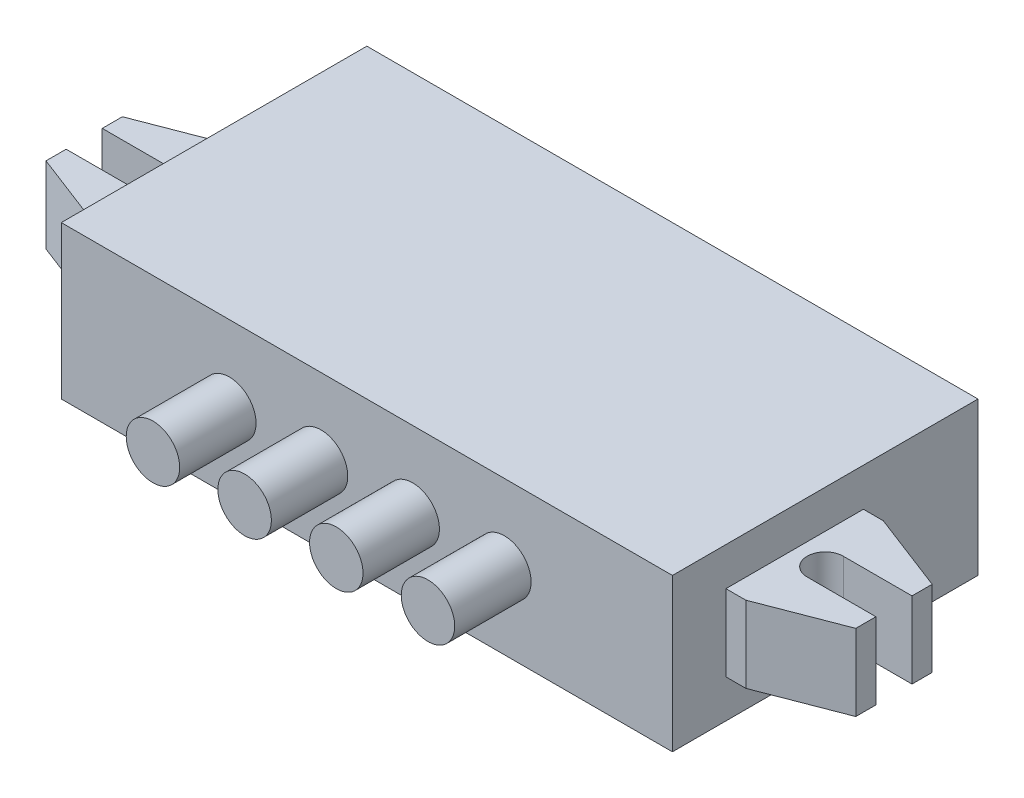
ISO-10303-21;
HEADER;
FILE_DESCRIPTION(('STEP AP214'),'2;1');
FILE_NAME('part.step','',(''),(''),'','','');
FILE_SCHEMA(('AUTOMOTIVE_DESIGN { 1 0 10303 214 1 1 1 1 }'));
ENDSEC;
DATA;
#1=APPLICATION_CONTEXT('core data for automotive mechanical design processes');
#2=APPLICATION_PROTOCOL_DEFINITION('international standard','automotive_design',2000,#1);
#3=PRODUCT_CONTEXT('',#1,'mechanical');
#4=PRODUCT('Part','Part','',(#3));
#5=PRODUCT_RELATED_PRODUCT_CATEGORY('part','',(#4));
#6=PRODUCT_DEFINITION_FORMATION('','',#4);
#7=PRODUCT_DEFINITION_CONTEXT('part definition',#1,'design');
#8=PRODUCT_DEFINITION('design','',#6,#7);
#9=PRODUCT_DEFINITION_SHAPE('','',#8);
#10=(LENGTH_UNIT() NAMED_UNIT(*) SI_UNIT(.MILLI.,.METRE.));
#11=(NAMED_UNIT(*) PLANE_ANGLE_UNIT() SI_UNIT($,.RADIAN.));
#12=(NAMED_UNIT(*) SI_UNIT($,.STERADIAN.) SOLID_ANGLE_UNIT());
#13=UNCERTAINTY_MEASURE_WITH_UNIT(LENGTH_MEASURE(1.E-05),#10,'distance_accuracy_value','');
#14=(GEOMETRIC_REPRESENTATION_CONTEXT(3) GLOBAL_UNCERTAINTY_ASSIGNED_CONTEXT((#13)) GLOBAL_UNIT_ASSIGNED_CONTEXT((#10,
#11,#12)) REPRESENTATION_CONTEXT('',''));
#15=CARTESIAN_POINT('',(0.,0.,0.));
#16=DIRECTION('',(0.,0.,1.));
#17=DIRECTION('',(1.,0.,0.));
#18=AXIS2_PLACEMENT_3D('',#15,#16,#17);
#19=CARTESIAN_POINT('',(25.4,6.35,-12.7));
#20=DIRECTION('',(-1.,0.,0.));
#21=DIRECTION('',(0.,0.,1.));
#22=AXIS2_PLACEMENT_3D('',#19,#20,#21);
#23=PLANE('',#22);
#24=DIRECTION('',(0.,-1.,0.));
#25=VECTOR('',#24,1.);
#26=CARTESIAN_POINT('',(25.4,3.175,-3.17500000000001));
#27=LINE('',#26,#25);
#28=CARTESIAN_POINT('',(25.4,3.175,-3.17500000000001));
#29=VERTEX_POINT('',#28);
#30=CARTESIAN_POINT('',(25.4,-3.175,-3.17500000000001));
#31=VERTEX_POINT('',#30);
#32=EDGE_CURVE('E478',#29,#31,#27,.T.);
#33=ORIENTED_EDGE('',*,*,#32,.T.);
#34=DIRECTION('',(0.,0.,1.));
#35=VECTOR('',#34,1.);
#36=CARTESIAN_POINT('',(25.4,-3.175,-3.17500000000001));
#37=LINE('',#36,#35);
#38=CARTESIAN_POINT('',(25.4,-3.175,8.25499999999998));
#39=VERTEX_POINT('',#38);
#40=EDGE_CURVE('E68',#31,#39,#37,.T.);
#41=ORIENTED_EDGE('',*,*,#40,.T.);
#42=DIRECTION('',(0.,-1.,0.));
#43=VECTOR('',#42,1.);
#44=CARTESIAN_POINT('',(25.4,3.175,8.25499999999998));
#45=LINE('',#44,#43);
#46=CARTESIAN_POINT('',(25.4,3.175,8.25499999999998));
#47=VERTEX_POINT('',#46);
#48=EDGE_CURVE('E483',#47,#39,#45,.T.);
#49=ORIENTED_EDGE('',*,*,#48,.F.);
#50=DIRECTION('',(0.,0.,1.));
#51=VECTOR('',#50,1.);
#52=CARTESIAN_POINT('',(25.4,3.175,-3.17500000000001));
#53=LINE('',#52,#51);
#54=EDGE_CURVE('E266',#29,#47,#53,.T.);
#55=ORIENTED_EDGE('',*,*,#54,.F.);
#56=EDGE_LOOP('',(#33,#41,#49,#55));
#57=FACE_BOUND('',#56,.T.);
#58=DIRECTION('',(0.,0.,-1.));
#59=VECTOR('',#58,1.);
#60=CARTESIAN_POINT('',(25.4,-6.35,-12.7));
#61=LINE('',#60,#59);
#62=CARTESIAN_POINT('',(25.4,-6.35,12.7));
#63=VERTEX_POINT('',#62);
#64=CARTESIAN_POINT('',(25.4,-6.35,-12.7));
#65=VERTEX_POINT('',#64);
#66=EDGE_CURVE('E380',#63,#65,#61,.T.);
#67=ORIENTED_EDGE('',*,*,#66,.T.);
#68=DIRECTION('',(0.,-1.,0.));
#69=VECTOR('',#68,1.);
#70=CARTESIAN_POINT('',(25.4,6.35,-12.7));
#71=LINE('',#70,#69);
#72=CARTESIAN_POINT('',(25.4,6.35,-12.7));
#73=VERTEX_POINT('',#72);
#74=EDGE_CURVE('E418',#73,#65,#71,.T.);
#75=ORIENTED_EDGE('',*,*,#74,.F.);
#76=DIRECTION('',(0.,0.,-1.));
#77=VECTOR('',#76,1.);
#78=CARTESIAN_POINT('',(25.4,6.35,-12.7));
#79=LINE('',#78,#77);
#80=CARTESIAN_POINT('',(25.4,6.35,12.7));
#81=VERTEX_POINT('',#80);
#82=EDGE_CURVE('E381',#81,#73,#79,.T.);
#83=ORIENTED_EDGE('',*,*,#82,.F.);
#84=DIRECTION('',(0.,-1.,0.));
#85=VECTOR('',#84,1.);
#86=CARTESIAN_POINT('',(25.4,6.35,12.7));
#87=LINE('',#86,#85);
#88=EDGE_CURVE('E395',#81,#63,#87,.T.);
#89=ORIENTED_EDGE('',*,*,#88,.T.);
#90=EDGE_LOOP('',(#67,#75,#83,#89));
#91=FACE_BOUND('',#90,.T.);
#92=ADVANCED_FACE('F53',(#57,#91),#23,.F.);
#93=CARTESIAN_POINT('',(-25.4,6.35,-12.7));
#94=DIRECTION('',(0.,0.,1.));
#95=DIRECTION('',(1.,0.,0.));
#96=AXIS2_PLACEMENT_3D('',#93,#94,#95);
#97=PLANE('',#96);
#98=DIRECTION('',(-1.,0.,0.));
#99=VECTOR('',#98,1.);
#100=CARTESIAN_POINT('',(-25.4,-6.35,-12.7));
#101=LINE('',#100,#99);
#102=CARTESIAN_POINT('',(-25.4,-6.35,-12.7));
#103=VERTEX_POINT('',#102);
#104=EDGE_CURVE('E399',#65,#103,#101,.T.);
#105=ORIENTED_EDGE('',*,*,#104,.T.);
#106=DIRECTION('',(0.,-1.,0.));
#107=VECTOR('',#106,1.);
#108=CARTESIAN_POINT('',(-25.4,6.35,-12.7));
#109=LINE('',#108,#107);
#110=CARTESIAN_POINT('',(-25.4,6.35,-12.7));
#111=VERTEX_POINT('',#110);
#112=EDGE_CURVE('E414',#111,#103,#109,.T.);
#113=ORIENTED_EDGE('',*,*,#112,.F.);
#114=DIRECTION('',(-1.,0.,0.));
#115=VECTOR('',#114,1.);
#116=CARTESIAN_POINT('',(-25.4,6.35,-12.7));
#117=LINE('',#116,#115);
#118=EDGE_CURVE('E385',#73,#111,#117,.T.);
#119=ORIENTED_EDGE('',*,*,#118,.F.);
#120=ORIENTED_EDGE('',*,*,#74,.T.);
#121=EDGE_LOOP('',(#105,#113,#119,#120));
#122=FACE_BOUND('',#121,.T.);
#123=ADVANCED_FACE('F459',(#122),#97,.F.);
#124=CARTESIAN_POINT('',(-25.4,6.35,-12.7));
#125=DIRECTION('',(1.,0.,0.));
#126=DIRECTION('',(0.,0.,-1.));
#127=AXIS2_PLACEMENT_3D('',#124,#125,#126);
#128=PLANE('',#127);
#129=DIRECTION('',(0.,-1.,0.));
#130=VECTOR('',#129,1.);
#131=CARTESIAN_POINT('',(-25.4,3.175,8.255));
#132=LINE('',#131,#130);
#133=CARTESIAN_POINT('',(-25.4,3.175,8.255));
#134=VERTEX_POINT('',#133);
#135=CARTESIAN_POINT('',(-25.4,-3.175,8.255));
#136=VERTEX_POINT('',#135);
#137=EDGE_CURVE('E314',#134,#136,#132,.T.);
#138=ORIENTED_EDGE('',*,*,#137,.T.);
#139=DIRECTION('',(0.,0.,-1.));
#140=VECTOR('',#139,1.);
#141=CARTESIAN_POINT('',(-25.4,-3.175,-3.175));
#142=LINE('',#141,#140);
#143=CARTESIAN_POINT('',(-25.4,-3.175,-3.175));
#144=VERTEX_POINT('',#143);
#145=EDGE_CURVE('E76',#136,#144,#142,.T.);
#146=ORIENTED_EDGE('',*,*,#145,.T.);
#147=DIRECTION('',(0.,-1.,0.));
#148=VECTOR('',#147,1.);
#149=CARTESIAN_POINT('',(-25.4,3.175,-3.175));
#150=LINE('',#149,#148);
#151=CARTESIAN_POINT('',(-25.4,3.175,-3.175));
#152=VERTEX_POINT('',#151);
#153=EDGE_CURVE('E376',#152,#144,#150,.T.);
#154=ORIENTED_EDGE('',*,*,#153,.F.);
#155=DIRECTION('',(0.,0.,-1.));
#156=VECTOR('',#155,1.);
#157=CARTESIAN_POINT('',(-25.4,3.175,-3.175));
#158=LINE('',#157,#156);
#159=EDGE_CURVE('E283',#134,#152,#158,.T.);
#160=ORIENTED_EDGE('',*,*,#159,.F.);
#161=EDGE_LOOP('',(#138,#146,#154,#160));
#162=FACE_BOUND('',#161,.T.);
#163=DIRECTION('',(0.,0.,1.));
#164=VECTOR('',#163,1.);
#165=CARTESIAN_POINT('',(-25.4,-6.35,-12.7));
#166=LINE('',#165,#164);
#167=CARTESIAN_POINT('',(-25.4,-6.35,12.7));
#168=VERTEX_POINT('',#167);
#169=EDGE_CURVE('E402',#103,#168,#166,.T.);
#170=ORIENTED_EDGE('',*,*,#169,.T.);
#171=DIRECTION('',(0.,-1.,0.));
#172=VECTOR('',#171,1.);
#173=CARTESIAN_POINT('',(-25.4,6.35,12.7));
#174=LINE('',#173,#172);
#175=CARTESIAN_POINT('',(-25.4,6.35,12.7));
#176=VERTEX_POINT('',#175);
#177=EDGE_CURVE('E410',#176,#168,#174,.T.);
#178=ORIENTED_EDGE('',*,*,#177,.F.);
#179=DIRECTION('',(0.,0.,1.));
#180=VECTOR('',#179,1.);
#181=CARTESIAN_POINT('',(-25.4,6.35,-12.7));
#182=LINE('',#181,#180);
#183=EDGE_CURVE('E389',#111,#176,#182,.T.);
#184=ORIENTED_EDGE('',*,*,#183,.F.);
#185=ORIENTED_EDGE('',*,*,#112,.T.);
#186=EDGE_LOOP('',(#170,#178,#184,#185));
#187=FACE_BOUND('',#186,.T.);
#188=ADVANCED_FACE('F439',(#162,#187),#128,.F.);
#189=CARTESIAN_POINT('',(-25.4,6.35,12.7));
#190=DIRECTION('',(0.,0.,-1.));
#191=DIRECTION('',(-1.,0.,0.));
#192=AXIS2_PLACEMENT_3D('',#189,#190,#191);
#193=PLANE('',#192);
#194=CARTESIAN_POINT('',(3.81,0.,12.7));
#195=DIRECTION('',(0.,0.,-1.));
#196=DIRECTION('',(-1.,0.,0.));
#197=AXIS2_PLACEMENT_3D('',#194,#195,#196);
#198=CIRCLE('',#197,2.2225);
#199=CARTESIAN_POINT('',(1.5875,0.,12.7));
#200=VERTEX_POINT('',#199);
#201=EDGE_CURVE('E11',#200,#200,#198,.F.);
#202=ORIENTED_EDGE('',*,*,#201,.F.);
#203=EDGE_LOOP('',(#202));
#204=FACE_BOUND('',#203,.T.);
#205=CARTESIAN_POINT('',(11.43,0.,12.7));
#206=DIRECTION('',(0.,0.,-1.));
#207=DIRECTION('',(-1.,0.,0.));
#208=AXIS2_PLACEMENT_3D('',#205,#206,#207);
#209=CIRCLE('',#208,2.2225);
#210=CARTESIAN_POINT('',(9.2075,0.,12.7));
#211=VERTEX_POINT('',#210);
#212=EDGE_CURVE('E61',#211,#211,#209,.F.);
#213=ORIENTED_EDGE('',*,*,#212,.F.);
#214=EDGE_LOOP('',(#213));
#215=FACE_BOUND('',#214,.T.);
#216=CARTESIAN_POINT('',(-11.43,0.,12.7));
#217=DIRECTION('',(0.,0.,-1.));
#218=DIRECTION('',(-1.,0.,0.));
#219=AXIS2_PLACEMENT_3D('',#216,#217,#218);
#220=CIRCLE('',#219,2.2225);
#221=CARTESIAN_POINT('',(-13.6525,0.,12.7));
#222=VERTEX_POINT('',#221);
#223=EDGE_CURVE('E426',#222,#222,#220,.F.);
#224=ORIENTED_EDGE('',*,*,#223,.F.);
#225=EDGE_LOOP('',(#224));
#226=FACE_BOUND('',#225,.T.);
#227=CARTESIAN_POINT('',(-3.81,0.,12.7));
#228=DIRECTION('',(0.,0.,-1.));
#229=DIRECTION('',(-1.,0.,0.));
#230=AXIS2_PLACEMENT_3D('',#227,#228,#229);
#231=CIRCLE('',#230,2.2225);
#232=CARTESIAN_POINT('',(-6.0325,0.,12.7));
#233=VERTEX_POINT('',#232);
#234=EDGE_CURVE('E422',#233,#233,#231,.F.);
#235=ORIENTED_EDGE('',*,*,#234,.F.);
#236=EDGE_LOOP('',(#235));
#237=FACE_BOUND('',#236,.T.);
#238=DIRECTION('',(1.,0.,0.));
#239=VECTOR('',#238,1.);
#240=CARTESIAN_POINT('',(-25.4,-6.35,12.7));
#241=LINE('',#240,#239);
#242=EDGE_CURVE('E386',#168,#63,#241,.T.);
#243=ORIENTED_EDGE('',*,*,#242,.T.);
#244=ORIENTED_EDGE('',*,*,#88,.F.);
#245=DIRECTION('',(1.,0.,0.));
#246=VECTOR('',#245,1.);
#247=CARTESIAN_POINT('',(-25.4,6.35,12.7));
#248=LINE('',#247,#246);
#249=EDGE_CURVE('E392',#176,#81,#248,.T.);
#250=ORIENTED_EDGE('',*,*,#249,.F.);
#251=ORIENTED_EDGE('',*,*,#177,.T.);
#252=EDGE_LOOP('',(#243,#244,#250,#251));
#253=FACE_BOUND('',#252,.T.);
#254=ADVANCED_FACE('F435',(#204,#215,#226,#237,#253),#193,.F.);
#255=CARTESIAN_POINT('',(0.,6.35,0.));
#256=DIRECTION('',(0.,1.,0.));
#257=DIRECTION('',(0.,0.,1.));
#258=AXIS2_PLACEMENT_3D('',#255,#256,#257);
#259=PLANE('',#258);
#260=ORIENTED_EDGE('',*,*,#82,.T.);
#261=ORIENTED_EDGE('',*,*,#118,.T.);
#262=ORIENTED_EDGE('',*,*,#183,.T.);
#263=ORIENTED_EDGE('',*,*,#249,.T.);
#264=EDGE_LOOP('',(#260,#261,#262,#263));
#265=FACE_BOUND('',#264,.T.);
#266=ADVANCED_FACE('F438',(#265),#259,.T.);
#267=CARTESIAN_POINT('',(0.,-6.35,0.));
#268=DIRECTION('',(0.,1.,0.));
#269=DIRECTION('',(0.,0.,1.));
#270=AXIS2_PLACEMENT_3D('',#267,#268,#269);
#271=PLANE('',#270);
#272=ORIENTED_EDGE('',*,*,#66,.F.);
#273=ORIENTED_EDGE('',*,*,#242,.F.);
#274=ORIENTED_EDGE('',*,*,#169,.F.);
#275=ORIENTED_EDGE('',*,*,#104,.F.);
#276=EDGE_LOOP('',(#272,#273,#274,#275));
#277=FACE_BOUND('',#276,.T.);
#278=ADVANCED_FACE('F456',(#277),#271,.F.);
#279=CARTESIAN_POINT('',(-25.4,3.175,-3.175));
#280=DIRECTION('',(0.,0.,1.));
#281=DIRECTION('',(1.,0.,0.));
#282=AXIS2_PLACEMENT_3D('',#279,#280,#281);
#283=PLANE('',#282);
#284=DIRECTION('',(-1.,0.,0.));
#285=VECTOR('',#284,1.);
#286=CARTESIAN_POINT('',(-25.4,-3.175,-3.175));
#287=LINE('',#286,#285);
#288=CARTESIAN_POINT('',(-27.051,-3.175,-3.175));
#289=VERTEX_POINT('',#288);
#290=EDGE_CURVE('E249',#144,#289,#287,.T.);
#291=ORIENTED_EDGE('',*,*,#290,.T.);
#292=DIRECTION('',(0.,-1.,0.));
#293=VECTOR('',#292,1.);
#294=CARTESIAN_POINT('',(-27.051,3.175,-3.175));
#295=LINE('',#294,#293);
#296=CARTESIAN_POINT('',(-27.051,3.175,-3.175));
#297=VERTEX_POINT('',#296);
#298=EDGE_CURVE('E372',#297,#289,#295,.T.);
#299=ORIENTED_EDGE('',*,*,#298,.F.);
#300=DIRECTION('',(-1.,0.,0.));
#301=VECTOR('',#300,1.);
#302=CARTESIAN_POINT('',(-25.4,3.175,-3.175));
#303=LINE('',#302,#301);
#304=EDGE_CURVE('E287',#152,#297,#303,.T.);
#305=ORIENTED_EDGE('',*,*,#304,.F.);
#306=ORIENTED_EDGE('',*,*,#153,.T.);
#307=EDGE_LOOP('',(#291,#299,#305,#306));
#308=FACE_BOUND('',#307,.T.);
#309=ADVANCED_FACE('F664',(#308),#283,.F.);
#310=CARTESIAN_POINT('',(-27.051,3.175,-3.175));
#311=DIRECTION('',(0.358979079308869,0.,0.933345606203059));
#312=DIRECTION('',(0.93334560620306,0.,-0.358979079308869));
#313=AXIS2_PLACEMENT_3D('',#310,#311,#312);
#314=PLANE('',#313);
#315=DIRECTION('',(-0.933345606203059,0.,0.358979079308869));
#316=VECTOR('',#315,1.);
#317=CARTESIAN_POINT('',(-27.051,-3.175,-3.175));
#318=LINE('',#317,#316);
#319=CARTESIAN_POINT('',(-33.655,-3.175,-0.635));
#320=VERTEX_POINT('',#319);
#321=EDGE_CURVE('E318',#289,#320,#318,.T.);
#322=ORIENTED_EDGE('',*,*,#321,.T.);
#323=DIRECTION('',(0.,-1.,0.));
#324=VECTOR('',#323,1.);
#325=CARTESIAN_POINT('',(-33.655,3.175,-0.635));
#326=LINE('',#325,#324);
#327=CARTESIAN_POINT('',(-33.655,3.175,-0.635));
#328=VERTEX_POINT('',#327);
#329=EDGE_CURVE('E368',#328,#320,#326,.T.);
#330=ORIENTED_EDGE('',*,*,#329,.F.);
#331=DIRECTION('',(-0.933345606203059,0.,0.358979079308869));
#332=VECTOR('',#331,1.);
#333=CARTESIAN_POINT('',(-27.051,3.175,-3.175));
#334=LINE('',#333,#332);
#335=EDGE_CURVE('E291',#297,#328,#334,.T.);
#336=ORIENTED_EDGE('',*,*,#335,.F.);
#337=ORIENTED_EDGE('',*,*,#298,.T.);
#338=EDGE_LOOP('',(#322,#330,#336,#337));
#339=FACE_BOUND('',#338,.T.);
#340=ADVANCED_FACE('F660',(#339),#314,.F.);
#341=CARTESIAN_POINT('',(-33.655,3.175,-0.635));
#342=DIRECTION('',(1.,0.,0.));
#343=DIRECTION('',(0.,0.,-1.));
#344=AXIS2_PLACEMENT_3D('',#341,#342,#343);
#345=PLANE('',#344);
#346=DIRECTION('',(0.,0.,1.));
#347=VECTOR('',#346,1.);
#348=CARTESIAN_POINT('',(-33.655,-3.175,-0.635));
#349=LINE('',#348,#347);
#350=CARTESIAN_POINT('',(-33.655,-3.175,1.04));
#351=VERTEX_POINT('',#350);
#352=EDGE_CURVE('E321',#320,#351,#349,.T.);
#353=ORIENTED_EDGE('',*,*,#352,.T.);
#354=DIRECTION('',(0.,-1.,0.));
#355=VECTOR('',#354,1.);
#356=CARTESIAN_POINT('',(-33.655,3.175,1.04));
#357=LINE('',#356,#355);
#358=CARTESIAN_POINT('',(-33.655,3.175,1.04));
#359=VERTEX_POINT('',#358);
#360=EDGE_CURVE('E364',#359,#351,#357,.T.);
#361=ORIENTED_EDGE('',*,*,#360,.F.);
#362=DIRECTION('',(0.,0.,1.));
#363=VECTOR('',#362,1.);
#364=CARTESIAN_POINT('',(-33.655,3.175,-0.635));
#365=LINE('',#364,#363);
#366=EDGE_CURVE('E294',#328,#359,#365,.T.);
#367=ORIENTED_EDGE('',*,*,#366,.F.);
#368=ORIENTED_EDGE('',*,*,#329,.T.);
#369=EDGE_LOOP('',(#353,#361,#367,#368));
#370=FACE_BOUND('',#369,.T.);
#371=ADVANCED_FACE('F656',(#370),#345,.F.);
#372=CARTESIAN_POINT('',(-33.655,3.175,1.04));
#373=DIRECTION('',(0.,0.,-1.));
#374=DIRECTION('',(-1.,0.,0.));
#375=AXIS2_PLACEMENT_3D('',#372,#373,#374);
#376=PLANE('',#375);
#377=DIRECTION('',(1.,0.,0.));
#378=VECTOR('',#377,1.);
#379=CARTESIAN_POINT('',(-33.655,-3.175,1.04));
#380=LINE('',#379,#378);
#381=CARTESIAN_POINT('',(-27.94,-3.175,1.04));
#382=VERTEX_POINT('',#381);
#383=EDGE_CURVE('E324',#351,#382,#380,.T.);
#384=ORIENTED_EDGE('',*,*,#383,.T.);
#385=DIRECTION('',(0.,-1.,0.));
#386=VECTOR('',#385,1.);
#387=CARTESIAN_POINT('',(-27.94,3.175,1.04));
#388=LINE('',#387,#386);
#389=CARTESIAN_POINT('',(-27.94,3.175,1.04));
#390=VERTEX_POINT('',#389);
#391=EDGE_CURVE('E360',#390,#382,#388,.T.);
#392=ORIENTED_EDGE('',*,*,#391,.F.);
#393=DIRECTION('',(1.,0.,0.));
#394=VECTOR('',#393,1.);
#395=CARTESIAN_POINT('',(-33.655,3.175,1.04));
#396=LINE('',#395,#394);
#397=EDGE_CURVE('E297',#359,#390,#396,.T.);
#398=ORIENTED_EDGE('',*,*,#397,.F.);
#399=ORIENTED_EDGE('',*,*,#360,.T.);
#400=EDGE_LOOP('',(#384,#392,#398,#399));
#401=FACE_BOUND('',#400,.T.);
#402=ADVANCED_FACE('F652',(#401),#376,.F.);
#403=CARTESIAN_POINT('',(-27.94,3.175,2.54));
#404=DIRECTION('',(0.,-1.,0.));
#405=DIRECTION('',(0.,0.,-1.));
#406=AXIS2_PLACEMENT_3D('',#403,#404,#405);
#407=CYLINDRICAL_SURFACE('',#406,1.5);
#408=CARTESIAN_POINT('',(-27.94,-3.175,2.54));
#409=DIRECTION('',(0.,-1.,0.));
#410=DIRECTION('',(0.,0.,1.));
#411=AXIS2_PLACEMENT_3D('',#408,#409,#410);
#412=CIRCLE('',#411,1.5);
#413=CARTESIAN_POINT('',(-27.94,-3.175,4.04));
#414=VERTEX_POINT('',#413);
#415=EDGE_CURVE('E327',#382,#414,#412,.T.);
#416=ORIENTED_EDGE('',*,*,#415,.T.);
#417=DIRECTION('',(0.,-1.,0.));
#418=VECTOR('',#417,1.);
#419=CARTESIAN_POINT('',(-27.94,3.175,4.04));
#420=LINE('',#419,#418);
#421=CARTESIAN_POINT('',(-27.94,3.175,4.04));
#422=VERTEX_POINT('',#421);
#423=EDGE_CURVE('E356',#422,#414,#420,.T.);
#424=ORIENTED_EDGE('',*,*,#423,.F.);
#425=CARTESIAN_POINT('',(-27.94,3.175,2.54));
#426=DIRECTION('',(0.,-1.,0.));
#427=DIRECTION('',(0.,0.,1.));
#428=AXIS2_PLACEMENT_3D('',#425,#426,#427);
#429=CIRCLE('',#428,1.5);
#430=EDGE_CURVE('E300',#390,#422,#429,.T.);
#431=ORIENTED_EDGE('',*,*,#430,.F.);
#432=ORIENTED_EDGE('',*,*,#391,.T.);
#433=EDGE_LOOP('',(#416,#424,#431,#432));
#434=FACE_BOUND('',#433,.T.);
#435=ADVANCED_FACE('F648',(#434),#407,.F.);
#436=CARTESIAN_POINT('',(-33.655,3.175,4.04));
#437=DIRECTION('',(0.,0.,1.));
#438=DIRECTION('',(1.,0.,0.));
#439=AXIS2_PLACEMENT_3D('',#436,#437,#438);
#440=PLANE('',#439);
#441=DIRECTION('',(-1.,0.,0.));
#442=VECTOR('',#441,1.);
#443=CARTESIAN_POINT('',(-33.655,-3.175,4.04));
#444=LINE('',#443,#442);
#445=CARTESIAN_POINT('',(-33.655,-3.175,4.04));
#446=VERTEX_POINT('',#445);
#447=EDGE_CURVE('E330',#414,#446,#444,.T.);
#448=ORIENTED_EDGE('',*,*,#447,.T.);
#449=DIRECTION('',(0.,-1.,0.));
#450=VECTOR('',#449,1.);
#451=CARTESIAN_POINT('',(-33.655,3.175,4.04));
#452=LINE('',#451,#450);
#453=CARTESIAN_POINT('',(-33.655,3.175,4.04));
#454=VERTEX_POINT('',#453);
#455=EDGE_CURVE('E352',#454,#446,#452,.T.);
#456=ORIENTED_EDGE('',*,*,#455,.F.);
#457=DIRECTION('',(-1.,0.,0.));
#458=VECTOR('',#457,1.);
#459=CARTESIAN_POINT('',(-33.655,3.175,4.04));
#460=LINE('',#459,#458);
#461=EDGE_CURVE('E303',#422,#454,#460,.T.);
#462=ORIENTED_EDGE('',*,*,#461,.F.);
#463=ORIENTED_EDGE('',*,*,#423,.T.);
#464=EDGE_LOOP('',(#448,#456,#462,#463));
#465=FACE_BOUND('',#464,.T.);
#466=ADVANCED_FACE('F644',(#465),#440,.F.);
#467=CARTESIAN_POINT('',(-33.655,3.175,5.715));
#468=DIRECTION('',(1.,0.,0.));
#469=DIRECTION('',(0.,0.,-1.));
#470=AXIS2_PLACEMENT_3D('',#467,#468,#469);
#471=PLANE('',#470);
#472=DIRECTION('',(0.,0.,1.));
#473=VECTOR('',#472,1.);
#474=CARTESIAN_POINT('',(-33.655,-3.175,5.715));
#475=LINE('',#474,#473);
#476=CARTESIAN_POINT('',(-33.655,-3.175,5.715));
#477=VERTEX_POINT('',#476);
#478=EDGE_CURVE('E333',#446,#477,#475,.T.);
#479=ORIENTED_EDGE('',*,*,#478,.T.);
#480=DIRECTION('',(0.,-1.,0.));
#481=VECTOR('',#480,1.);
#482=CARTESIAN_POINT('',(-33.655,3.175,5.715));
#483=LINE('',#482,#481);
#484=CARTESIAN_POINT('',(-33.655,3.175,5.715));
#485=VERTEX_POINT('',#484);
#486=EDGE_CURVE('E348',#485,#477,#483,.T.);
#487=ORIENTED_EDGE('',*,*,#486,.F.);
#488=DIRECTION('',(0.,0.,1.));
#489=VECTOR('',#488,1.);
#490=CARTESIAN_POINT('',(-33.655,3.175,5.715));
#491=LINE('',#490,#489);
#492=EDGE_CURVE('E306',#454,#485,#491,.T.);
#493=ORIENTED_EDGE('',*,*,#492,.F.);
#494=ORIENTED_EDGE('',*,*,#455,.T.);
#495=EDGE_LOOP('',(#479,#487,#493,#494));
#496=FACE_BOUND('',#495,.T.);
#497=ADVANCED_FACE('F640',(#496),#471,.F.);
#498=CARTESIAN_POINT('',(-27.051,3.175,8.255));
#499=DIRECTION('',(0.358979079308869,0.,-0.933345606203059));
#500=DIRECTION('',(-0.93334560620306,0.,-0.358979079308869));
#501=AXIS2_PLACEMENT_3D('',#498,#499,#500);
#502=PLANE('',#501);
#503=DIRECTION('',(0.933345606203059,0.,0.358979079308869));
#504=VECTOR('',#503,1.);
#505=CARTESIAN_POINT('',(-27.051,-3.175,8.255));
#506=LINE('',#505,#504);
#507=CARTESIAN_POINT('',(-27.051,-3.175,8.255));
#508=VERTEX_POINT('',#507);
#509=EDGE_CURVE('E336',#477,#508,#506,.T.);
#510=ORIENTED_EDGE('',*,*,#509,.T.);
#511=DIRECTION('',(0.,-1.,0.));
#512=VECTOR('',#511,1.);
#513=CARTESIAN_POINT('',(-27.051,3.175,8.255));
#514=LINE('',#513,#512);
#515=CARTESIAN_POINT('',(-27.051,3.175,8.255));
#516=VERTEX_POINT('',#515);
#517=EDGE_CURVE('E344',#516,#508,#514,.T.);
#518=ORIENTED_EDGE('',*,*,#517,.F.);
#519=DIRECTION('',(0.933345606203059,0.,0.358979079308869));
#520=VECTOR('',#519,1.);
#521=CARTESIAN_POINT('',(-27.051,3.175,8.255));
#522=LINE('',#521,#520);
#523=EDGE_CURVE('E309',#485,#516,#522,.T.);
#524=ORIENTED_EDGE('',*,*,#523,.F.);
#525=ORIENTED_EDGE('',*,*,#486,.T.);
#526=EDGE_LOOP('',(#510,#518,#524,#525));
#527=FACE_BOUND('',#526,.T.);
#528=ADVANCED_FACE('F636',(#527),#502,.F.);
#529=CARTESIAN_POINT('',(-25.4,3.175,8.255));
#530=DIRECTION('',(0.,0.,-1.));
#531=DIRECTION('',(-1.,0.,0.));
#532=AXIS2_PLACEMENT_3D('',#529,#530,#531);
#533=PLANE('',#532);
#534=DIRECTION('',(1.,0.,0.));
#535=VECTOR('',#534,1.);
#536=CARTESIAN_POINT('',(-25.4,-3.175,8.255));
#537=LINE('',#536,#535);
#538=EDGE_CURVE('E288',#508,#136,#537,.T.);
#539=ORIENTED_EDGE('',*,*,#538,.T.);
#540=ORIENTED_EDGE('',*,*,#137,.F.);
#541=DIRECTION('',(1.,0.,0.));
#542=VECTOR('',#541,1.);
#543=CARTESIAN_POINT('',(-25.4,3.175,8.255));
#544=LINE('',#543,#542);
#545=EDGE_CURVE('E312',#516,#134,#544,.T.);
#546=ORIENTED_EDGE('',*,*,#545,.F.);
#547=ORIENTED_EDGE('',*,*,#517,.T.);
#548=EDGE_LOOP('',(#539,#540,#546,#547));
#549=FACE_BOUND('',#548,.T.);
#550=ADVANCED_FACE('F630',(#549),#533,.F.);
#551=CARTESIAN_POINT('',(-27.94,3.175,2.54));
#552=DIRECTION('',(0.,1.,0.));
#553=DIRECTION('',(0.,0.,1.));
#554=AXIS2_PLACEMENT_3D('',#551,#552,#553);
#555=PLANE('',#554);
#556=ORIENTED_EDGE('',*,*,#159,.T.);
#557=ORIENTED_EDGE('',*,*,#304,.T.);
#558=ORIENTED_EDGE('',*,*,#335,.T.);
#559=ORIENTED_EDGE('',*,*,#366,.T.);
#560=ORIENTED_EDGE('',*,*,#397,.T.);
#561=ORIENTED_EDGE('',*,*,#430,.T.);
#562=ORIENTED_EDGE('',*,*,#461,.T.);
#563=ORIENTED_EDGE('',*,*,#492,.T.);
#564=ORIENTED_EDGE('',*,*,#523,.T.);
#565=ORIENTED_EDGE('',*,*,#545,.T.);
#566=EDGE_LOOP('',(#556,#557,#558,#559,#560,#561,#562,#563,#564,#565));
#567=FACE_BOUND('',#566,.T.);
#568=ADVANCED_FACE('F627',(#567),#555,.T.);
#569=CARTESIAN_POINT('',(-27.94,-3.175,2.54));
#570=DIRECTION('',(0.,1.,0.));
#571=DIRECTION('',(0.,0.,1.));
#572=AXIS2_PLACEMENT_3D('',#569,#570,#571);
#573=PLANE('',#572);
#574=ORIENTED_EDGE('',*,*,#145,.F.);
#575=ORIENTED_EDGE('',*,*,#538,.F.);
#576=ORIENTED_EDGE('',*,*,#509,.F.);
#577=ORIENTED_EDGE('',*,*,#478,.F.);
#578=ORIENTED_EDGE('',*,*,#447,.F.);
#579=ORIENTED_EDGE('',*,*,#415,.F.);
#580=ORIENTED_EDGE('',*,*,#383,.F.);
#581=ORIENTED_EDGE('',*,*,#352,.F.);
#582=ORIENTED_EDGE('',*,*,#321,.F.);
#583=ORIENTED_EDGE('',*,*,#290,.F.);
#584=EDGE_LOOP('',(#574,#575,#576,#577,#578,#579,#580,#581,#582,#583));
#585=FACE_BOUND('',#584,.T.);
#586=ADVANCED_FACE('F600',(#585),#573,.F.);
#587=CARTESIAN_POINT('',(27.94,3.175,2.53999999999999));
#588=DIRECTION('',(0.,-1.,0.));
#589=DIRECTION('',(0.,0.,-1.));
#590=AXIS2_PLACEMENT_3D('',#587,#588,#589);
#591=CYLINDRICAL_SURFACE('',#590,1.5);
#592=CARTESIAN_POINT('',(27.94,-3.175,2.53999999999999));
#593=DIRECTION('',(0.,-1.,0.));
#594=DIRECTION('',(0.,0.,-1.));
#595=AXIS2_PLACEMENT_3D('',#592,#593,#594);
#596=CIRCLE('',#595,1.5);
#597=CARTESIAN_POINT('',(27.94,-3.175,4.03999999999999));
#598=VERTEX_POINT('',#597);
#599=CARTESIAN_POINT('',(27.94,-3.175,1.03999999999999));
#600=VERTEX_POINT('',#599);
#601=EDGE_CURVE('E236',#598,#600,#596,.T.);
#602=ORIENTED_EDGE('',*,*,#601,.T.);
#603=DIRECTION('',(0.,-1.,0.));
#604=VECTOR('',#603,1.);
#605=CARTESIAN_POINT('',(27.94,3.175,1.03999999999999));
#606=LINE('',#605,#604);
#607=CARTESIAN_POINT('',(27.94,3.175,1.03999999999999));
#608=VERTEX_POINT('',#607);
#609=EDGE_CURVE('E541',#608,#600,#606,.T.);
#610=ORIENTED_EDGE('',*,*,#609,.F.);
#611=CARTESIAN_POINT('',(27.94,3.175,2.53999999999999));
#612=DIRECTION('',(0.,-1.,0.));
#613=DIRECTION('',(0.,0.,-1.));
#614=AXIS2_PLACEMENT_3D('',#611,#612,#613);
#615=CIRCLE('',#614,1.5);
#616=CARTESIAN_POINT('',(27.94,3.175,4.03999999999999));
#617=VERTEX_POINT('',#616);
#618=EDGE_CURVE('E230',#617,#608,#615,.T.);
#619=ORIENTED_EDGE('',*,*,#618,.F.);
#620=DIRECTION('',(0.,-1.,0.));
#621=VECTOR('',#620,1.);
#622=CARTESIAN_POINT('',(27.94,3.175,4.03999999999999));
#623=LINE('',#622,#621);
#624=EDGE_CURVE('E222',#617,#598,#623,.T.);
#625=ORIENTED_EDGE('',*,*,#624,.T.);
#626=EDGE_LOOP('',(#602,#610,#619,#625));
#627=FACE_BOUND('',#626,.T.);
#628=ADVANCED_FACE('F234',(#627),#591,.F.);
#629=CARTESIAN_POINT('',(33.655,3.175,1.03999999999999));
#630=DIRECTION('',(0.,0.,-1.));
#631=DIRECTION('',(-1.,0.,0.));
#632=AXIS2_PLACEMENT_3D('',#629,#630,#631);
#633=PLANE('',#632);
#634=DIRECTION('',(1.,0.,0.));
#635=VECTOR('',#634,1.);
#636=CARTESIAN_POINT('',(33.655,-3.175,1.03999999999999));
#637=LINE('',#636,#635);
#638=CARTESIAN_POINT('',(33.655,-3.175,1.03999999999999));
#639=VERTEX_POINT('',#638);
#640=EDGE_CURVE('E243',#600,#639,#637,.T.);
#641=ORIENTED_EDGE('',*,*,#640,.T.);
#642=DIRECTION('',(0.,-1.,0.));
#643=VECTOR('',#642,1.);
#644=CARTESIAN_POINT('',(33.655,3.175,1.03999999999999));
#645=LINE('',#644,#643);
#646=CARTESIAN_POINT('',(33.655,3.175,1.03999999999999));
#647=VERTEX_POINT('',#646);
#648=EDGE_CURVE('E528',#647,#639,#645,.T.);
#649=ORIENTED_EDGE('',*,*,#648,.F.);
#650=DIRECTION('',(1.,0.,0.));
#651=VECTOR('',#650,1.);
#652=CARTESIAN_POINT('',(33.655,3.175,1.03999999999999));
#653=LINE('',#652,#651);
#654=EDGE_CURVE('E278',#608,#647,#653,.T.);
#655=ORIENTED_EDGE('',*,*,#654,.F.);
#656=ORIENTED_EDGE('',*,*,#609,.T.);
#657=EDGE_LOOP('',(#641,#649,#655,#656));
#658=FACE_BOUND('',#657,.T.);
#659=ADVANCED_FACE('F539',(#658),#633,.F.);
#660=CARTESIAN_POINT('',(33.655,3.175,-0.635000000000008));
#661=DIRECTION('',(-1.,0.,0.));
#662=DIRECTION('',(0.,0.,1.));
#663=AXIS2_PLACEMENT_3D('',#660,#661,#662);
#664=PLANE('',#663);
#665=DIRECTION('',(0.,0.,-1.));
#666=VECTOR('',#665,1.);
#667=CARTESIAN_POINT('',(33.655,-3.175,-0.635000000000008));
#668=LINE('',#667,#666);
#669=CARTESIAN_POINT('',(33.655,-3.175,-0.635000000000008));
#670=VERTEX_POINT('',#669);
#671=EDGE_CURVE('E251',#639,#670,#668,.T.);
#672=ORIENTED_EDGE('',*,*,#671,.T.);
#673=DIRECTION('',(0.,-1.,0.));
#674=VECTOR('',#673,1.);
#675=CARTESIAN_POINT('',(33.655,3.175,-0.635000000000008));
#676=LINE('',#675,#674);
#677=CARTESIAN_POINT('',(33.655,3.175,-0.635000000000008));
#678=VERTEX_POINT('',#677);
#679=EDGE_CURVE('E491',#678,#670,#676,.T.);
#680=ORIENTED_EDGE('',*,*,#679,.F.);
#681=DIRECTION('',(0.,0.,-1.));
#682=VECTOR('',#681,1.);
#683=CARTESIAN_POINT('',(33.655,3.175,-0.635000000000008));
#684=LINE('',#683,#682);
#685=EDGE_CURVE('E275',#647,#678,#684,.T.);
#686=ORIENTED_EDGE('',*,*,#685,.F.);
#687=ORIENTED_EDGE('',*,*,#648,.T.);
#688=EDGE_LOOP('',(#672,#680,#686,#687));
#689=FACE_BOUND('',#688,.T.);
#690=ADVANCED_FACE('F524',(#689),#664,.F.);
#691=CARTESIAN_POINT('',(27.051,3.175,-3.17500000000001));
#692=DIRECTION('',(-0.358979079308869,0.,0.93334560620306));
#693=DIRECTION('',(0.93334560620306,0.,0.358979079308869));
#694=AXIS2_PLACEMENT_3D('',#691,#692,#693);
#695=PLANE('',#694);
#696=DIRECTION('',(-0.93334560620306,0.,-0.358979079308869));
#697=VECTOR('',#696,1.);
#698=CARTESIAN_POINT('',(27.051,-3.175,-3.17500000000001));
#699=LINE('',#698,#697);
#700=CARTESIAN_POINT('',(27.051,-3.175,-3.17500000000001));
#701=VERTEX_POINT('',#700);
#702=EDGE_CURVE('E517',#670,#701,#699,.T.);
#703=ORIENTED_EDGE('',*,*,#702,.T.);
#704=DIRECTION('',(0.,-1.,0.));
#705=VECTOR('',#704,1.);
#706=CARTESIAN_POINT('',(27.051,3.175,-3.17500000000001));
#707=LINE('',#706,#705);
#708=CARTESIAN_POINT('',(27.051,3.175,-3.17500000000001));
#709=VERTEX_POINT('',#708);
#710=EDGE_CURVE('E484',#709,#701,#707,.T.);
#711=ORIENTED_EDGE('',*,*,#710,.F.);
#712=DIRECTION('',(-0.93334560620306,0.,-0.358979079308869));
#713=VECTOR('',#712,1.);
#714=CARTESIAN_POINT('',(27.051,3.175,-3.17500000000001));
#715=LINE('',#714,#713);
#716=EDGE_CURVE('E272',#678,#709,#715,.T.);
#717=ORIENTED_EDGE('',*,*,#716,.F.);
#718=ORIENTED_EDGE('',*,*,#679,.T.);
#719=EDGE_LOOP('',(#703,#711,#717,#718));
#720=FACE_BOUND('',#719,.T.);
#721=ADVANCED_FACE('F531',(#720),#695,.F.);
#722=CARTESIAN_POINT('',(25.4,3.175,-3.17500000000001));
#723=DIRECTION('',(0.,0.,1.));
#724=DIRECTION('',(1.,0.,0.));
#725=AXIS2_PLACEMENT_3D('',#722,#723,#724);
#726=PLANE('',#725);
#727=DIRECTION('',(-1.,0.,0.));
#728=VECTOR('',#727,1.);
#729=CARTESIAN_POINT('',(25.4,-3.175,-3.17500000000001));
#730=LINE('',#729,#728);
#731=EDGE_CURVE('E514',#701,#31,#730,.T.);
#732=ORIENTED_EDGE('',*,*,#731,.T.);
#733=ORIENTED_EDGE('',*,*,#32,.F.);
#734=DIRECTION('',(-1.,0.,0.));
#735=VECTOR('',#734,1.);
#736=CARTESIAN_POINT('',(25.4,3.175,-3.17500000000001));
#737=LINE('',#736,#735);
#738=EDGE_CURVE('E269',#709,#29,#737,.T.);
#739=ORIENTED_EDGE('',*,*,#738,.F.);
#740=ORIENTED_EDGE('',*,*,#710,.T.);
#741=EDGE_LOOP('',(#732,#733,#739,#740));
#742=FACE_BOUND('',#741,.T.);
#743=ADVANCED_FACE('F534',(#742),#726,.F.);
#744=CARTESIAN_POINT('',(25.4,3.175,8.25499999999998));
#745=DIRECTION('',(0.,0.,-1.));
#746=DIRECTION('',(-1.,0.,0.));
#747=AXIS2_PLACEMENT_3D('',#744,#745,#746);
#748=PLANE('',#747);
#749=DIRECTION('',(1.,0.,0.));
#750=VECTOR('',#749,1.);
#751=CARTESIAN_POINT('',(25.4,-3.175,8.25499999999998));
#752=LINE('',#751,#750);
#753=CARTESIAN_POINT('',(27.051,-3.175,8.25499999999999));
#754=VERTEX_POINT('',#753);
#755=EDGE_CURVE('E509',#39,#754,#752,.T.);
#756=ORIENTED_EDGE('',*,*,#755,.T.);
#757=DIRECTION('',(0.,-1.,0.));
#758=VECTOR('',#757,1.);
#759=CARTESIAN_POINT('',(27.051,3.175,8.25499999999999));
#760=LINE('',#759,#758);
#761=CARTESIAN_POINT('',(27.051,3.175,8.25499999999999));
#762=VERTEX_POINT('',#761);
#763=EDGE_CURVE('E488',#762,#754,#760,.T.);
#764=ORIENTED_EDGE('',*,*,#763,.F.);
#765=DIRECTION('',(1.,0.,0.));
#766=VECTOR('',#765,1.);
#767=CARTESIAN_POINT('',(25.4,3.175,8.25499999999998));
#768=LINE('',#767,#766);
#769=EDGE_CURVE('E263',#47,#762,#768,.T.);
#770=ORIENTED_EDGE('',*,*,#769,.F.);
#771=ORIENTED_EDGE('',*,*,#48,.T.);
#772=EDGE_LOOP('',(#756,#764,#770,#771));
#773=FACE_BOUND('',#772,.T.);
#774=ADVANCED_FACE('F609',(#773),#748,.F.);
#775=CARTESIAN_POINT('',(27.051,3.175,8.25499999999999));
#776=DIRECTION('',(-0.35897907930887,0.,-0.933345606203059));
#777=DIRECTION('',(-0.933345606203059,0.,0.35897907930887));
#778=AXIS2_PLACEMENT_3D('',#775,#776,#777);
#779=PLANE('',#778);
#780=DIRECTION('',(0.933345606203059,0.,-0.35897907930887));
#781=VECTOR('',#780,1.);
#782=CARTESIAN_POINT('',(27.051,-3.175,8.25499999999999));
#783=LINE('',#782,#781);
#784=CARTESIAN_POINT('',(33.655,-3.175,5.71499999999999));
#785=VERTEX_POINT('',#784);
#786=EDGE_CURVE('E506',#754,#785,#783,.T.);
#787=ORIENTED_EDGE('',*,*,#786,.T.);
#788=DIRECTION('',(0.,-1.,0.));
#789=VECTOR('',#788,1.);
#790=CARTESIAN_POINT('',(33.655,3.175,5.71499999999999));
#791=LINE('',#790,#789);
#792=CARTESIAN_POINT('',(33.655,3.175,5.71499999999999));
#793=VERTEX_POINT('',#792);
#794=EDGE_CURVE('E498',#793,#785,#791,.T.);
#795=ORIENTED_EDGE('',*,*,#794,.F.);
#796=DIRECTION('',(0.933345606203059,0.,-0.35897907930887));
#797=VECTOR('',#796,1.);
#798=CARTESIAN_POINT('',(27.051,3.175,8.25499999999999));
#799=LINE('',#798,#797);
#800=EDGE_CURVE('E260',#762,#793,#799,.T.);
#801=ORIENTED_EDGE('',*,*,#800,.F.);
#802=ORIENTED_EDGE('',*,*,#763,.T.);
#803=EDGE_LOOP('',(#787,#795,#801,#802));
#804=FACE_BOUND('',#803,.T.);
#805=ADVANCED_FACE('F612',(#804),#779,.F.);
#806=CARTESIAN_POINT('',(33.655,3.175,5.71499999999999));
#807=DIRECTION('',(-1.,0.,0.));
#808=DIRECTION('',(0.,0.,1.));
#809=AXIS2_PLACEMENT_3D('',#806,#807,#808);
#810=PLANE('',#809);
#811=DIRECTION('',(0.,0.,-1.));
#812=VECTOR('',#811,1.);
#813=CARTESIAN_POINT('',(33.655,-3.175,5.71499999999999));
#814=LINE('',#813,#812);
#815=CARTESIAN_POINT('',(33.655,-3.175,4.03999999999999));
#816=VERTEX_POINT('',#815);
#817=EDGE_CURVE('E229',#785,#816,#814,.T.);
#818=ORIENTED_EDGE('',*,*,#817,.T.);
#819=DIRECTION('',(0.,-1.,0.));
#820=VECTOR('',#819,1.);
#821=CARTESIAN_POINT('',(33.655,3.175,4.03999999999999));
#822=LINE('',#821,#820);
#823=CARTESIAN_POINT('',(33.655,3.175,4.03999999999999));
#824=VERTEX_POINT('',#823);
#825=EDGE_CURVE('E225',#824,#816,#822,.T.);
#826=ORIENTED_EDGE('',*,*,#825,.F.);
#827=DIRECTION('',(0.,0.,-1.));
#828=VECTOR('',#827,1.);
#829=CARTESIAN_POINT('',(33.655,3.175,5.71499999999999));
#830=LINE('',#829,#828);
#831=EDGE_CURVE('E257',#793,#824,#830,.T.);
#832=ORIENTED_EDGE('',*,*,#831,.F.);
#833=ORIENTED_EDGE('',*,*,#794,.T.);
#834=EDGE_LOOP('',(#818,#826,#832,#833));
#835=FACE_BOUND('',#834,.T.);
#836=ADVANCED_FACE('F616',(#835),#810,.F.);
#837=CARTESIAN_POINT('',(33.655,3.175,4.03999999999999));
#838=DIRECTION('',(0.,0.,1.));
#839=DIRECTION('',(1.,0.,0.));
#840=AXIS2_PLACEMENT_3D('',#837,#838,#839);
#841=PLANE('',#840);
#842=DIRECTION('',(-1.,0.,0.));
#843=VECTOR('',#842,1.);
#844=CARTESIAN_POINT('',(33.655,-3.175,4.03999999999999));
#845=LINE('',#844,#843);
#846=EDGE_CURVE('E218',#816,#598,#845,.T.);
#847=ORIENTED_EDGE('',*,*,#846,.T.);
#848=ORIENTED_EDGE('',*,*,#624,.F.);
#849=DIRECTION('',(-1.,0.,0.));
#850=VECTOR('',#849,1.);
#851=CARTESIAN_POINT('',(33.655,3.175,4.03999999999999));
#852=LINE('',#851,#850);
#853=EDGE_CURVE('E239',#824,#617,#852,.T.);
#854=ORIENTED_EDGE('',*,*,#853,.F.);
#855=ORIENTED_EDGE('',*,*,#825,.T.);
#856=EDGE_LOOP('',(#847,#848,#854,#855));
#857=FACE_BOUND('',#856,.T.);
#858=ADVANCED_FACE('F220',(#857),#841,.F.);
#859=CARTESIAN_POINT('',(27.94,3.175,2.53999999999999));
#860=DIRECTION('',(0.,-1.,0.));
#861=DIRECTION('',(0.,0.,-1.));
#862=AXIS2_PLACEMENT_3D('',#859,#860,#861);
#863=PLANE('',#862);
#864=ORIENTED_EDGE('',*,*,#618,.T.);
#865=ORIENTED_EDGE('',*,*,#654,.T.);
#866=ORIENTED_EDGE('',*,*,#685,.T.);
#867=ORIENTED_EDGE('',*,*,#716,.T.);
#868=ORIENTED_EDGE('',*,*,#738,.T.);
#869=ORIENTED_EDGE('',*,*,#54,.T.);
#870=ORIENTED_EDGE('',*,*,#769,.T.);
#871=ORIENTED_EDGE('',*,*,#800,.T.);
#872=ORIENTED_EDGE('',*,*,#831,.T.);
#873=ORIENTED_EDGE('',*,*,#853,.T.);
#874=EDGE_LOOP('',(#864,#865,#866,#867,#868,#869,#870,#871,#872,#873));
#875=FACE_BOUND('',#874,.T.);
#876=ADVANCED_FACE('F536',(#875),#863,.F.);
#877=CARTESIAN_POINT('',(27.94,-3.175,2.53999999999999));
#878=DIRECTION('',(0.,-1.,0.));
#879=DIRECTION('',(0.,0.,-1.));
#880=AXIS2_PLACEMENT_3D('',#877,#878,#879);
#881=PLANE('',#880);
#882=ORIENTED_EDGE('',*,*,#601,.F.);
#883=ORIENTED_EDGE('',*,*,#846,.F.);
#884=ORIENTED_EDGE('',*,*,#817,.F.);
#885=ORIENTED_EDGE('',*,*,#786,.F.);
#886=ORIENTED_EDGE('',*,*,#755,.F.);
#887=ORIENTED_EDGE('',*,*,#40,.F.);
#888=ORIENTED_EDGE('',*,*,#731,.F.);
#889=ORIENTED_EDGE('',*,*,#702,.F.);
#890=ORIENTED_EDGE('',*,*,#671,.F.);
#891=ORIENTED_EDGE('',*,*,#640,.F.);
#892=EDGE_LOOP('',(#882,#883,#884,#885,#886,#887,#888,#889,#890,#891));
#893=FACE_BOUND('',#892,.T.);
#894=ADVANCED_FACE('F241',(#893),#881,.T.);
#895=CARTESIAN_POINT('',(-3.81,0.,19.05));
#896=DIRECTION('',(0.,0.,-1.));
#897=DIRECTION('',(-1.,0.,0.));
#898=AXIS2_PLACEMENT_3D('',#895,#896,#897);
#899=CYLINDRICAL_SURFACE('',#898,2.2225);
#900=CARTESIAN_POINT('',(-3.81,0.,19.05));
#901=DIRECTION('',(0.,0.,1.));
#902=DIRECTION('',(1.,0.,0.));
#903=AXIS2_PLACEMENT_3D('',#900,#901,#902);
#904=CIRCLE('',#903,2.2225);
#905=CARTESIAN_POINT('',(-1.5875,0.,19.05));
#906=VERTEX_POINT('',#905);
#907=EDGE_CURVE('E544',#906,#906,#904,.T.);
#908=ORIENTED_EDGE('',*,*,#907,.F.);
#909=EDGE_LOOP('',(#908));
#910=FACE_BOUND('',#909,.T.);
#911=ORIENTED_EDGE('',*,*,#234,.T.);
#912=EDGE_LOOP('',(#911));
#913=FACE_BOUND('',#912,.T.);
#914=ADVANCED_FACE('F593',(#910,#913),#899,.T.);
#915=CARTESIAN_POINT('',(-3.81,0.,19.05));
#916=DIRECTION('',(0.,0.,1.));
#917=DIRECTION('',(1.,0.,0.));
#918=AXIS2_PLACEMENT_3D('',#915,#916,#917);
#919=PLANE('',#918);
#920=ORIENTED_EDGE('',*,*,#907,.T.);
#921=EDGE_LOOP('',(#920));
#922=FACE_BOUND('',#921,.T.);
#923=ADVANCED_FACE('F586',(#922),#919,.T.);
#924=CARTESIAN_POINT('',(-11.43,0.,19.05));
#925=DIRECTION('',(0.,0.,-1.));
#926=DIRECTION('',(-1.,0.,0.));
#927=AXIS2_PLACEMENT_3D('',#924,#925,#926);
#928=CYLINDRICAL_SURFACE('',#927,2.2225);
#929=CARTESIAN_POINT('',(-11.43,0.,19.05));
#930=DIRECTION('',(0.,0.,1.));
#931=DIRECTION('',(1.,0.,0.));
#932=AXIS2_PLACEMENT_3D('',#929,#930,#931);
#933=CIRCLE('',#932,2.2225);
#934=CARTESIAN_POINT('',(-9.2075,0.,19.05));
#935=VERTEX_POINT('',#934);
#936=EDGE_CURVE('E550',#935,#935,#933,.T.);
#937=ORIENTED_EDGE('',*,*,#936,.F.);
#938=EDGE_LOOP('',(#937));
#939=FACE_BOUND('',#938,.T.);
#940=ORIENTED_EDGE('',*,*,#223,.T.);
#941=EDGE_LOOP('',(#940));
#942=FACE_BOUND('',#941,.T.);
#943=ADVANCED_FACE('F583',(#939,#942),#928,.T.);
#944=CARTESIAN_POINT('',(-11.43,0.,19.05));
#945=DIRECTION('',(0.,0.,1.));
#946=DIRECTION('',(1.,0.,0.));
#947=AXIS2_PLACEMENT_3D('',#944,#945,#946);
#948=PLANE('',#947);
#949=ORIENTED_EDGE('',*,*,#936,.T.);
#950=EDGE_LOOP('',(#949));
#951=FACE_BOUND('',#950,.T.);
#952=ADVANCED_FACE('F580',(#951),#948,.T.);
#953=CARTESIAN_POINT('',(11.43,0.,19.05));
#954=DIRECTION('',(0.,0.,-1.));
#955=DIRECTION('',(-1.,0.,0.));
#956=AXIS2_PLACEMENT_3D('',#953,#954,#955);
#957=CYLINDRICAL_SURFACE('',#956,2.2225);
#958=CARTESIAN_POINT('',(11.43,0.,19.05));
#959=DIRECTION('',(0.,0.,1.));
#960=DIRECTION('',(-1.,0.,0.));
#961=AXIS2_PLACEMENT_3D('',#958,#959,#960);
#962=CIRCLE('',#961,2.2225);
#963=CARTESIAN_POINT('',(9.2075,0.,19.05));
#964=VERTEX_POINT('',#963);
#965=EDGE_CURVE('E554',#964,#964,#962,.T.);
#966=ORIENTED_EDGE('',*,*,#965,.F.);
#967=EDGE_LOOP('',(#966));
#968=FACE_BOUND('',#967,.T.);
#969=ORIENTED_EDGE('',*,*,#212,.T.);
#970=EDGE_LOOP('',(#969));
#971=FACE_BOUND('',#970,.T.);
#972=ADVANCED_FACE('F433',(#968,#971),#957,.T.);
#973=CARTESIAN_POINT('',(11.43,0.,19.05));
#974=DIRECTION('',(0.,0.,-1.));
#975=DIRECTION('',(-1.,0.,0.));
#976=AXIS2_PLACEMENT_3D('',#973,#974,#975);
#977=PLANE('',#976);
#978=ORIENTED_EDGE('',*,*,#965,.T.);
#979=EDGE_LOOP('',(#978));
#980=FACE_BOUND('',#979,.T.);
#981=ADVANCED_FACE('F568',(#980),#977,.F.);
#982=CARTESIAN_POINT('',(3.81,0.,19.05));
#983=DIRECTION('',(0.,0.,-1.));
#984=DIRECTION('',(-1.,0.,0.));
#985=AXIS2_PLACEMENT_3D('',#982,#983,#984);
#986=CYLINDRICAL_SURFACE('',#985,2.2225);
#987=CARTESIAN_POINT('',(3.81,0.,19.05));
#988=DIRECTION('',(0.,0.,1.));
#989=DIRECTION('',(-1.,0.,0.));
#990=AXIS2_PLACEMENT_3D('',#987,#988,#989);
#991=CIRCLE('',#990,2.2225);
#992=CARTESIAN_POINT('',(1.5875,0.,19.05));
#993=VERTEX_POINT('',#992);
#994=EDGE_CURVE('E558',#993,#993,#991,.T.);
#995=ORIENTED_EDGE('',*,*,#994,.F.);
#996=EDGE_LOOP('',(#995));
#997=FACE_BOUND('',#996,.T.);
#998=ORIENTED_EDGE('',*,*,#201,.T.);
#999=EDGE_LOOP('',(#998));
#1000=FACE_BOUND('',#999,.T.);
#1001=ADVANCED_FACE('F565',(#997,#1000),#986,.T.);
#1002=CARTESIAN_POINT('',(3.81,0.,19.05));
#1003=DIRECTION('',(0.,0.,-1.));
#1004=DIRECTION('',(-1.,0.,0.));
#1005=AXIS2_PLACEMENT_3D('',#1002,#1003,#1004);
#1006=PLANE('',#1005);
#1007=ORIENTED_EDGE('',*,*,#994,.T.);
#1008=EDGE_LOOP('',(#1007));
#1009=FACE_BOUND('',#1008,.T.);
#1010=ADVANCED_FACE('F563',(#1009),#1006,.F.);
#1011=CLOSED_SHELL('',(#92,#123,#188,#254,#266,#278,#309,#340,#371,#402,#435,#466,#497,#528,
#550,#568,#586,#628,#659,#690,#721,#743,#774,#805,#836,#858,#876,#894,#914,#923,#943,#952,#972,
#981,#1001,#1010));
#1012=MANIFOLD_SOLID_BREP('B2',#1011);
#1013=ADVANCED_BREP_SHAPE_REPRESENTATION('',(#18,#1012),#14);
#1014=SHAPE_DEFINITION_REPRESENTATION(#9,#1013);
ENDSEC;
END-ISO-10303-21;
